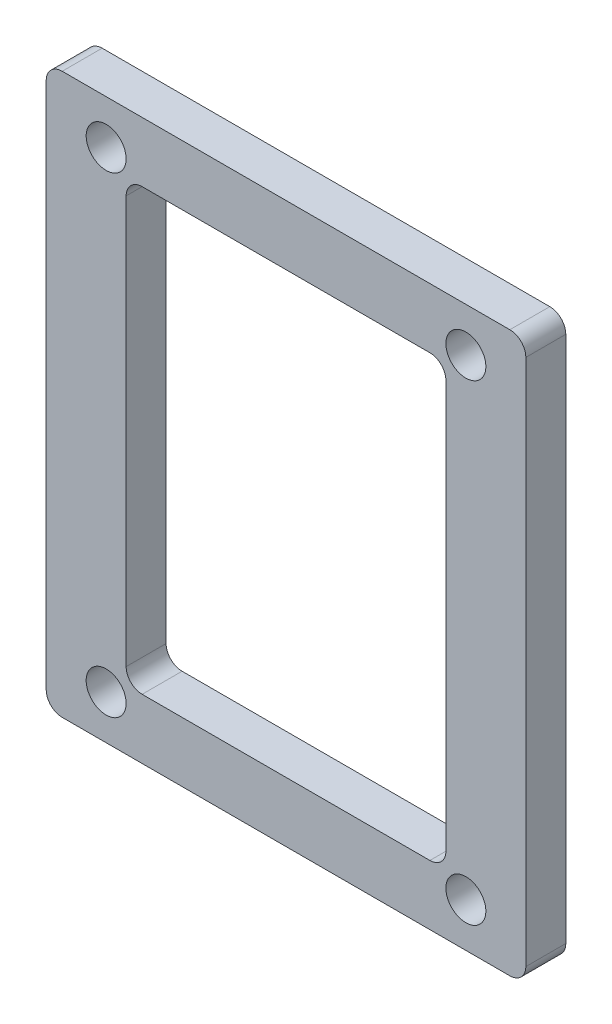
ISO-10303-21;
HEADER;
FILE_DESCRIPTION(('STEP AP214'),'2;1');
FILE_NAME('part.step','',(''),(''),'','','');
FILE_SCHEMA(('AUTOMOTIVE_DESIGN { 1 0 10303 214 1 1 1 1 }'));
ENDSEC;
DATA;
#1=APPLICATION_CONTEXT('core data for automotive mechanical design processes');
#2=APPLICATION_PROTOCOL_DEFINITION('international standard','automotive_design',2000,#1);
#3=PRODUCT_CONTEXT('',#1,'mechanical');
#4=PRODUCT('Part','Part','',(#3));
#5=PRODUCT_RELATED_PRODUCT_CATEGORY('part','',(#4));
#6=PRODUCT_DEFINITION_FORMATION('','',#4);
#7=PRODUCT_DEFINITION_CONTEXT('part definition',#1,'design');
#8=PRODUCT_DEFINITION('design','',#6,#7);
#9=PRODUCT_DEFINITION_SHAPE('','',#8);
#10=(LENGTH_UNIT() NAMED_UNIT(*) SI_UNIT(.MILLI.,.METRE.));
#11=(NAMED_UNIT(*) PLANE_ANGLE_UNIT() SI_UNIT($,.RADIAN.));
#12=(NAMED_UNIT(*) SI_UNIT($,.STERADIAN.) SOLID_ANGLE_UNIT());
#13=UNCERTAINTY_MEASURE_WITH_UNIT(LENGTH_MEASURE(1.E-05),#10,'distance_accuracy_value','');
#14=(GEOMETRIC_REPRESENTATION_CONTEXT(3) GLOBAL_UNCERTAINTY_ASSIGNED_CONTEXT((#13)) GLOBAL_UNIT_ASSIGNED_CONTEXT((#10,
#11,#12)) REPRESENTATION_CONTEXT('',''));
#15=CARTESIAN_POINT('',(0.,0.,0.));
#16=DIRECTION('',(0.,0.,1.));
#17=DIRECTION('',(1.,0.,0.));
#18=AXIS2_PLACEMENT_3D('',#15,#16,#17);
#19=CARTESIAN_POINT('',(-28.,-33.,5.));
#20=DIRECTION('',(0.,0.,-1.));
#21=DIRECTION('',(-1.,0.,0.));
#22=AXIS2_PLACEMENT_3D('',#19,#20,#21);
#23=CYLINDRICAL_SURFACE('',#22,2.);
#24=CARTESIAN_POINT('',(-28.,-33.,0.));
#25=DIRECTION('',(0.,0.,1.));
#26=DIRECTION('',(-1.,0.,0.));
#27=AXIS2_PLACEMENT_3D('',#24,#25,#26);
#28=CIRCLE('',#27,2.);
#29=CARTESIAN_POINT('',(-30.,-33.,0.));
#30=VERTEX_POINT('',#29);
#31=CARTESIAN_POINT('',(-28.,-35.,0.));
#32=VERTEX_POINT('',#31);
#33=EDGE_CURVE('E231',#30,#32,#28,.T.);
#34=ORIENTED_EDGE('',*,*,#33,.T.);
#35=DIRECTION('',(0.,0.,-1.));
#36=VECTOR('',#35,1.);
#37=CARTESIAN_POINT('',(-28.,-35.,5.));
#38=LINE('',#37,#36);
#39=CARTESIAN_POINT('',(-28.,-35.,5.));
#40=VERTEX_POINT('',#39);
#41=EDGE_CURVE('E11',#40,#32,#38,.T.);
#42=ORIENTED_EDGE('',*,*,#41,.F.);
#43=CARTESIAN_POINT('',(-28.,-33.,5.));
#44=DIRECTION('',(0.,0.,1.));
#45=DIRECTION('',(-1.,0.,0.));
#46=AXIS2_PLACEMENT_3D('',#43,#44,#45);
#47=CIRCLE('',#46,2.);
#48=CARTESIAN_POINT('',(-30.,-33.,5.));
#49=VERTEX_POINT('',#48);
#50=EDGE_CURVE('E249',#49,#40,#47,.T.);
#51=ORIENTED_EDGE('',*,*,#50,.F.);
#52=DIRECTION('',(0.,0.,-1.));
#53=VECTOR('',#52,1.);
#54=CARTESIAN_POINT('',(-30.,-33.,5.));
#55=LINE('',#54,#53);
#56=EDGE_CURVE('E275',#49,#30,#55,.T.);
#57=ORIENTED_EDGE('',*,*,#56,.T.);
#58=EDGE_LOOP('',(#34,#42,#51,#57));
#59=FACE_BOUND('',#58,.T.);
#60=ADVANCED_FACE('F39',(#59),#23,.T.);
#61=CARTESIAN_POINT('',(28.,-35.,5.));
#62=DIRECTION('',(0.,1.,0.));
#63=DIRECTION('',(-1.,0.,0.));
#64=AXIS2_PLACEMENT_3D('',#61,#62,#63);
#65=PLANE('',#64);
#66=DIRECTION('',(1.,0.,0.));
#67=VECTOR('',#66,1.);
#68=CARTESIAN_POINT('',(28.,-35.,0.));
#69=LINE('',#68,#67);
#70=CARTESIAN_POINT('',(28.,-35.,0.));
#71=VERTEX_POINT('',#70);
#72=EDGE_CURVE('E279',#32,#71,#69,.T.);
#73=ORIENTED_EDGE('',*,*,#72,.T.);
#74=DIRECTION('',(0.,0.,-1.));
#75=VECTOR('',#74,1.);
#76=CARTESIAN_POINT('',(28.,-35.,5.));
#77=LINE('',#76,#75);
#78=CARTESIAN_POINT('',(28.,-35.,5.));
#79=VERTEX_POINT('',#78);
#80=EDGE_CURVE('E47',#79,#71,#77,.T.);
#81=ORIENTED_EDGE('',*,*,#80,.F.);
#82=DIRECTION('',(1.,0.,0.));
#83=VECTOR('',#82,1.);
#84=CARTESIAN_POINT('',(28.,-35.,5.));
#85=LINE('',#84,#83);
#86=EDGE_CURVE('E253',#40,#79,#85,.T.);
#87=ORIENTED_EDGE('',*,*,#86,.F.);
#88=ORIENTED_EDGE('',*,*,#41,.T.);
#89=EDGE_LOOP('',(#73,#81,#87,#88));
#90=FACE_BOUND('',#89,.T.);
#91=ADVANCED_FACE('F348',(#90),#65,.F.);
#92=CARTESIAN_POINT('',(28.,-33.,5.));
#93=DIRECTION('',(0.,0.,-1.));
#94=DIRECTION('',(-1.,0.,0.));
#95=AXIS2_PLACEMENT_3D('',#92,#93,#94);
#96=CYLINDRICAL_SURFACE('',#95,2.);
#97=CARTESIAN_POINT('',(28.,-33.,0.));
#98=DIRECTION('',(0.,0.,1.));
#99=DIRECTION('',(1.,0.,0.));
#100=AXIS2_PLACEMENT_3D('',#97,#98,#99);
#101=CIRCLE('',#100,2.);
#102=CARTESIAN_POINT('',(30.,-33.,0.));
#103=VERTEX_POINT('',#102);
#104=EDGE_CURVE('E282',#71,#103,#101,.T.);
#105=ORIENTED_EDGE('',*,*,#104,.T.);
#106=DIRECTION('',(0.,0.,-1.));
#107=VECTOR('',#106,1.);
#108=CARTESIAN_POINT('',(30.,-33.,5.));
#109=LINE('',#108,#107);
#110=CARTESIAN_POINT('',(30.,-33.,5.));
#111=VERTEX_POINT('',#110);
#112=EDGE_CURVE('E318',#111,#103,#109,.T.);
#113=ORIENTED_EDGE('',*,*,#112,.F.);
#114=CARTESIAN_POINT('',(28.,-33.,5.));
#115=DIRECTION('',(0.,0.,1.));
#116=DIRECTION('',(1.,0.,0.));
#117=AXIS2_PLACEMENT_3D('',#114,#115,#116);
#118=CIRCLE('',#117,2.);
#119=EDGE_CURVE('E257',#79,#111,#118,.T.);
#120=ORIENTED_EDGE('',*,*,#119,.F.);
#121=ORIENTED_EDGE('',*,*,#80,.T.);
#122=EDGE_LOOP('',(#105,#113,#120,#121));
#123=FACE_BOUND('',#122,.T.);
#124=ADVANCED_FACE('F327',(#123),#96,.T.);
#125=CARTESIAN_POINT('',(30.,-33.,5.));
#126=DIRECTION('',(-1.,0.,0.));
#127=DIRECTION('',(0.,-1.,0.));
#128=AXIS2_PLACEMENT_3D('',#125,#126,#127);
#129=PLANE('',#128);
#130=DIRECTION('',(0.,1.,0.));
#131=VECTOR('',#130,1.);
#132=CARTESIAN_POINT('',(30.,-33.,0.));
#133=LINE('',#132,#131);
#134=CARTESIAN_POINT('',(30.,33.,0.));
#135=VERTEX_POINT('',#134);
#136=EDGE_CURVE('E285',#103,#135,#133,.T.);
#137=ORIENTED_EDGE('',*,*,#136,.T.);
#138=DIRECTION('',(0.,0.,-1.));
#139=VECTOR('',#138,1.);
#140=CARTESIAN_POINT('',(30.,33.,5.));
#141=LINE('',#140,#139);
#142=CARTESIAN_POINT('',(30.,33.,5.));
#143=VERTEX_POINT('',#142);
#144=EDGE_CURVE('E314',#143,#135,#141,.T.);
#145=ORIENTED_EDGE('',*,*,#144,.F.);
#146=DIRECTION('',(0.,1.,0.));
#147=VECTOR('',#146,1.);
#148=CARTESIAN_POINT('',(30.,-33.,5.));
#149=LINE('',#148,#147);
#150=EDGE_CURVE('E260',#111,#143,#149,.T.);
#151=ORIENTED_EDGE('',*,*,#150,.F.);
#152=ORIENTED_EDGE('',*,*,#112,.T.);
#153=EDGE_LOOP('',(#137,#145,#151,#152));
#154=FACE_BOUND('',#153,.T.);
#155=ADVANCED_FACE('F338',(#154),#129,.F.);
#156=CARTESIAN_POINT('',(28.,33.,5.));
#157=DIRECTION('',(0.,0.,-1.));
#158=DIRECTION('',(-1.,0.,0.));
#159=AXIS2_PLACEMENT_3D('',#156,#157,#158);
#160=CYLINDRICAL_SURFACE('',#159,2.);
#161=CARTESIAN_POINT('',(28.,33.,0.));
#162=DIRECTION('',(0.,0.,1.));
#163=DIRECTION('',(1.,0.,0.));
#164=AXIS2_PLACEMENT_3D('',#161,#162,#163);
#165=CIRCLE('',#164,2.);
#166=CARTESIAN_POINT('',(28.,35.,0.));
#167=VERTEX_POINT('',#166);
#168=EDGE_CURVE('E288',#135,#167,#165,.T.);
#169=ORIENTED_EDGE('',*,*,#168,.T.);
#170=DIRECTION('',(0.,0.,-1.));
#171=VECTOR('',#170,1.);
#172=CARTESIAN_POINT('',(28.,35.,5.));
#173=LINE('',#172,#171);
#174=CARTESIAN_POINT('',(28.,35.,5.));
#175=VERTEX_POINT('',#174);
#176=EDGE_CURVE('E310',#175,#167,#173,.T.);
#177=ORIENTED_EDGE('',*,*,#176,.F.);
#178=CARTESIAN_POINT('',(28.,33.,5.));
#179=DIRECTION('',(0.,0.,1.));
#180=DIRECTION('',(1.,0.,0.));
#181=AXIS2_PLACEMENT_3D('',#178,#179,#180);
#182=CIRCLE('',#181,2.);
#183=EDGE_CURVE('E263',#143,#175,#182,.T.);
#184=ORIENTED_EDGE('',*,*,#183,.F.);
#185=ORIENTED_EDGE('',*,*,#144,.T.);
#186=EDGE_LOOP('',(#169,#177,#184,#185));
#187=FACE_BOUND('',#186,.T.);
#188=ADVANCED_FACE('F342',(#187),#160,.T.);
#189=CARTESIAN_POINT('',(28.,35.,5.));
#190=DIRECTION('',(0.,-1.,0.));
#191=DIRECTION('',(0.,0.,-1.));
#192=AXIS2_PLACEMENT_3D('',#189,#190,#191);
#193=PLANE('',#192);
#194=DIRECTION('',(-1.,0.,0.));
#195=VECTOR('',#194,1.);
#196=CARTESIAN_POINT('',(28.,35.,0.));
#197=LINE('',#196,#195);
#198=CARTESIAN_POINT('',(-28.,35.,0.));
#199=VERTEX_POINT('',#198);
#200=EDGE_CURVE('E291',#167,#199,#197,.T.);
#201=ORIENTED_EDGE('',*,*,#200,.T.);
#202=DIRECTION('',(0.,0.,-1.));
#203=VECTOR('',#202,1.);
#204=CARTESIAN_POINT('',(-28.,35.,5.));
#205=LINE('',#204,#203);
#206=CARTESIAN_POINT('',(-28.,35.,5.));
#207=VERTEX_POINT('',#206);
#208=EDGE_CURVE('E306',#207,#199,#205,.T.);
#209=ORIENTED_EDGE('',*,*,#208,.F.);
#210=DIRECTION('',(-1.,0.,0.));
#211=VECTOR('',#210,1.);
#212=CARTESIAN_POINT('',(28.,35.,5.));
#213=LINE('',#212,#211);
#214=EDGE_CURVE('E266',#175,#207,#213,.T.);
#215=ORIENTED_EDGE('',*,*,#214,.F.);
#216=ORIENTED_EDGE('',*,*,#176,.T.);
#217=EDGE_LOOP('',(#201,#209,#215,#216));
#218=FACE_BOUND('',#217,.T.);
#219=ADVANCED_FACE('F361',(#218),#193,.F.);
#220=CARTESIAN_POINT('',(-28.,33.,5.));
#221=DIRECTION('',(0.,0.,-1.));
#222=DIRECTION('',(-1.,0.,0.));
#223=AXIS2_PLACEMENT_3D('',#220,#221,#222);
#224=CYLINDRICAL_SURFACE('',#223,2.00000000000001);
#225=CARTESIAN_POINT('',(-28.,33.,0.));
#226=DIRECTION('',(0.,0.,1.));
#227=DIRECTION('',(1.,0.,0.));
#228=AXIS2_PLACEMENT_3D('',#225,#226,#227);
#229=CIRCLE('',#228,2.00000000000001);
#230=CARTESIAN_POINT('',(-30.,33.,0.));
#231=VERTEX_POINT('',#230);
#232=EDGE_CURVE('E294',#199,#231,#229,.T.);
#233=ORIENTED_EDGE('',*,*,#232,.T.);
#234=DIRECTION('',(0.,0.,-1.));
#235=VECTOR('',#234,1.);
#236=CARTESIAN_POINT('',(-30.,33.,5.));
#237=LINE('',#236,#235);
#238=CARTESIAN_POINT('',(-30.,33.,5.));
#239=VERTEX_POINT('',#238);
#240=EDGE_CURVE('E302',#239,#231,#237,.T.);
#241=ORIENTED_EDGE('',*,*,#240,.F.);
#242=CARTESIAN_POINT('',(-28.,33.,5.));
#243=DIRECTION('',(0.,0.,1.));
#244=DIRECTION('',(1.,0.,0.));
#245=AXIS2_PLACEMENT_3D('',#242,#243,#244);
#246=CIRCLE('',#245,2.00000000000001);
#247=EDGE_CURVE('E269',#207,#239,#246,.T.);
#248=ORIENTED_EDGE('',*,*,#247,.F.);
#249=ORIENTED_EDGE('',*,*,#208,.T.);
#250=EDGE_LOOP('',(#233,#241,#248,#249));
#251=FACE_BOUND('',#250,.T.);
#252=ADVANCED_FACE('F359',(#251),#224,.T.);
#253=CARTESIAN_POINT('',(-30.,-33.,5.));
#254=DIRECTION('',(1.,0.,0.));
#255=DIRECTION('',(0.,1.,0.));
#256=AXIS2_PLACEMENT_3D('',#253,#254,#255);
#257=PLANE('',#256);
#258=DIRECTION('',(0.,-1.,0.));
#259=VECTOR('',#258,1.);
#260=CARTESIAN_POINT('',(-30.,-33.,0.));
#261=LINE('',#260,#259);
#262=EDGE_CURVE('E254',#231,#30,#261,.T.);
#263=ORIENTED_EDGE('',*,*,#262,.T.);
#264=ORIENTED_EDGE('',*,*,#56,.F.);
#265=DIRECTION('',(0.,-1.,0.));
#266=VECTOR('',#265,1.);
#267=CARTESIAN_POINT('',(-30.,-33.,5.));
#268=LINE('',#267,#266);
#269=EDGE_CURVE('E272',#239,#49,#268,.T.);
#270=ORIENTED_EDGE('',*,*,#269,.F.);
#271=ORIENTED_EDGE('',*,*,#240,.T.);
#272=EDGE_LOOP('',(#263,#264,#270,#271));
#273=FACE_BOUND('',#272,.T.);
#274=ADVANCED_FACE('F354',(#273),#257,.F.);
#275=CARTESIAN_POINT('',(-28.,-33.,5.));
#276=DIRECTION('',(0.,0.,-1.));
#277=DIRECTION('',(-1.,0.,0.));
#278=AXIS2_PLACEMENT_3D('',#275,#276,#277);
#279=PLANE('',#278);
#280=CARTESIAN_POINT('',(22.5,-29.5,5.));
#281=DIRECTION('',(0.,0.,1.));
#282=DIRECTION('',(1.,0.,0.));
#283=AXIS2_PLACEMENT_3D('',#280,#281,#282);
#284=CIRCLE('',#283,2.5);
#285=CARTESIAN_POINT('',(25.,-29.5,5.));
#286=VERTEX_POINT('',#285);
#287=EDGE_CURVE('E549',#286,#286,#284,.T.);
#288=ORIENTED_EDGE('',*,*,#287,.F.);
#289=EDGE_LOOP('',(#288));
#290=FACE_BOUND('',#289,.T.);
#291=CARTESIAN_POINT('',(-22.5,29.5000000000002,5.));
#292=DIRECTION('',(0.,0.,1.));
#293=DIRECTION('',(1.,0.,0.));
#294=AXIS2_PLACEMENT_3D('',#291,#292,#293);
#295=CIRCLE('',#294,2.5);
#296=CARTESIAN_POINT('',(-20.,29.5000000000002,5.));
#297=VERTEX_POINT('',#296);
#298=EDGE_CURVE('E557',#297,#297,#295,.T.);
#299=ORIENTED_EDGE('',*,*,#298,.F.);
#300=EDGE_LOOP('',(#299));
#301=FACE_BOUND('',#300,.T.);
#302=CARTESIAN_POINT('',(22.5,29.5000000000002,5.));
#303=DIRECTION('',(0.,0.,1.));
#304=DIRECTION('',(1.,0.,0.));
#305=AXIS2_PLACEMENT_3D('',#302,#303,#304);
#306=CIRCLE('',#305,2.5);
#307=CARTESIAN_POINT('',(25.,29.5000000000002,5.));
#308=VERTEX_POINT('',#307);
#309=EDGE_CURVE('E588',#308,#308,#306,.T.);
#310=ORIENTED_EDGE('',*,*,#309,.F.);
#311=EDGE_LOOP('',(#310));
#312=FACE_BOUND('',#311,.T.);
#313=CARTESIAN_POINT('',(-22.5,-29.5,5.));
#314=DIRECTION('',(0.,0.,1.));
#315=DIRECTION('',(1.,0.,0.));
#316=AXIS2_PLACEMENT_3D('',#313,#314,#315);
#317=CIRCLE('',#316,2.5);
#318=CARTESIAN_POINT('',(-20.,-29.5,5.));
#319=VERTEX_POINT('',#318);
#320=EDGE_CURVE('E181',#319,#319,#317,.T.);
#321=ORIENTED_EDGE('',*,*,#320,.F.);
#322=EDGE_LOOP('',(#321));
#323=FACE_BOUND('',#322,.T.);
#324=DIRECTION('',(0.,-1.,0.));
#325=VECTOR('',#324,1.);
#326=CARTESIAN_POINT('',(20.,-25.5,5.));
#327=LINE('',#326,#325);
#328=CARTESIAN_POINT('',(20.,25.5,5.));
#329=VERTEX_POINT('',#328);
#330=CARTESIAN_POINT('',(20.,-25.5,5.));
#331=VERTEX_POINT('',#330);
#332=EDGE_CURVE('E161',#329,#331,#327,.T.);
#333=ORIENTED_EDGE('',*,*,#332,.T.);
#334=CARTESIAN_POINT('',(18.,-25.5,5.));
#335=DIRECTION('',(0.,0.,-1.));
#336=DIRECTION('',(1.,0.,0.));
#337=AXIS2_PLACEMENT_3D('',#334,#335,#336);
#338=CIRCLE('',#337,2.);
#339=CARTESIAN_POINT('',(18.,-27.5,5.));
#340=VERTEX_POINT('',#339);
#341=EDGE_CURVE('E154',#331,#340,#338,.T.);
#342=ORIENTED_EDGE('',*,*,#341,.T.);
#343=DIRECTION('',(-1.,0.,0.));
#344=VECTOR('',#343,1.);
#345=CARTESIAN_POINT('',(-18.,-27.5,5.));
#346=LINE('',#345,#344);
#347=CARTESIAN_POINT('',(-18.,-27.5,5.));
#348=VERTEX_POINT('',#347);
#349=EDGE_CURVE('E164',#340,#348,#346,.T.);
#350=ORIENTED_EDGE('',*,*,#349,.T.);
#351=CARTESIAN_POINT('',(-18.,-25.5,5.));
#352=DIRECTION('',(0.,0.,-1.));
#353=DIRECTION('',(-1.,0.,0.));
#354=AXIS2_PLACEMENT_3D('',#351,#352,#353);
#355=CIRCLE('',#354,2.);
#356=CARTESIAN_POINT('',(-20.,-25.5,5.));
#357=VERTEX_POINT('',#356);
#358=EDGE_CURVE('E54',#348,#357,#355,.T.);
#359=ORIENTED_EDGE('',*,*,#358,.T.);
#360=DIRECTION('',(0.,1.,0.));
#361=VECTOR('',#360,1.);
#362=CARTESIAN_POINT('',(-20.,-25.5,5.));
#363=LINE('',#362,#361);
#364=CARTESIAN_POINT('',(-20.,25.5,5.));
#365=VERTEX_POINT('',#364);
#366=EDGE_CURVE('E186',#357,#365,#363,.T.);
#367=ORIENTED_EDGE('',*,*,#366,.T.);
#368=CARTESIAN_POINT('',(-18.,25.5,5.));
#369=DIRECTION('',(0.,0.,-1.));
#370=DIRECTION('',(-1.,0.,0.));
#371=AXIS2_PLACEMENT_3D('',#368,#369,#370);
#372=CIRCLE('',#371,2.);
#373=CARTESIAN_POINT('',(-18.,27.5,5.));
#374=VERTEX_POINT('',#373);
#375=EDGE_CURVE('E190',#365,#374,#372,.T.);
#376=ORIENTED_EDGE('',*,*,#375,.T.);
#377=DIRECTION('',(1.,0.,0.));
#378=VECTOR('',#377,1.);
#379=CARTESIAN_POINT('',(-18.,27.5,5.));
#380=LINE('',#379,#378);
#381=CARTESIAN_POINT('',(18.,27.5,5.));
#382=VERTEX_POINT('',#381);
#383=EDGE_CURVE('E194',#374,#382,#380,.T.);
#384=ORIENTED_EDGE('',*,*,#383,.T.);
#385=CARTESIAN_POINT('',(18.,25.5,5.));
#386=DIRECTION('',(0.,0.,-1.));
#387=DIRECTION('',(-1.,0.,0.));
#388=AXIS2_PLACEMENT_3D('',#385,#386,#387);
#389=CIRCLE('',#388,2.);
#390=EDGE_CURVE('E198',#382,#329,#389,.T.);
#391=ORIENTED_EDGE('',*,*,#390,.T.);
#392=EDGE_LOOP('',(#333,#342,#350,#359,#367,#376,#384,#391));
#393=FACE_BOUND('',#392,.T.);
#394=ORIENTED_EDGE('',*,*,#50,.T.);
#395=ORIENTED_EDGE('',*,*,#86,.T.);
#396=ORIENTED_EDGE('',*,*,#119,.T.);
#397=ORIENTED_EDGE('',*,*,#150,.T.);
#398=ORIENTED_EDGE('',*,*,#183,.T.);
#399=ORIENTED_EDGE('',*,*,#214,.T.);
#400=ORIENTED_EDGE('',*,*,#247,.T.);
#401=ORIENTED_EDGE('',*,*,#269,.T.);
#402=EDGE_LOOP('',(#394,#395,#396,#397,#398,#399,#400,#401));
#403=FACE_BOUND('',#402,.T.);
#404=ADVANCED_FACE('F169',(#290,#301,#312,#323,#393,#403),#279,.F.);
#405=CARTESIAN_POINT('',(-28.,-33.,0.));
#406=DIRECTION('',(0.,0.,-1.));
#407=DIRECTION('',(-1.,0.,0.));
#408=AXIS2_PLACEMENT_3D('',#405,#406,#407);
#409=PLANE('',#408);
#410=CARTESIAN_POINT('',(22.5,-29.5,0.));
#411=DIRECTION('',(0.,0.,1.));
#412=DIRECTION('',(1.,0.,0.));
#413=AXIS2_PLACEMENT_3D('',#410,#411,#412);
#414=CIRCLE('',#413,2.5);
#415=CARTESIAN_POINT('',(25.,-29.5,0.));
#416=VERTEX_POINT('',#415);
#417=EDGE_CURVE('E546',#416,#416,#414,.T.);
#418=ORIENTED_EDGE('',*,*,#417,.T.);
#419=EDGE_LOOP('',(#418));
#420=FACE_BOUND('',#419,.T.);
#421=CARTESIAN_POINT('',(-22.5,29.5000000000002,0.));
#422=DIRECTION('',(0.,0.,1.));
#423=DIRECTION('',(1.,0.,0.));
#424=AXIS2_PLACEMENT_3D('',#421,#422,#423);
#425=CIRCLE('',#424,2.5);
#426=CARTESIAN_POINT('',(-20.,29.5000000000002,0.));
#427=VERTEX_POINT('',#426);
#428=EDGE_CURVE('E551',#427,#427,#425,.T.);
#429=ORIENTED_EDGE('',*,*,#428,.T.);
#430=EDGE_LOOP('',(#429));
#431=FACE_BOUND('',#430,.T.);
#432=CARTESIAN_POINT('',(22.5,29.5000000000002,0.));
#433=DIRECTION('',(0.,0.,1.));
#434=DIRECTION('',(1.,0.,0.));
#435=AXIS2_PLACEMENT_3D('',#432,#433,#434);
#436=CIRCLE('',#435,2.5);
#437=CARTESIAN_POINT('',(25.,29.5000000000002,0.));
#438=VERTEX_POINT('',#437);
#439=EDGE_CURVE('E563',#438,#438,#436,.T.);
#440=ORIENTED_EDGE('',*,*,#439,.T.);
#441=EDGE_LOOP('',(#440));
#442=FACE_BOUND('',#441,.T.);
#443=CARTESIAN_POINT('',(-22.5,-29.5,0.));
#444=DIRECTION('',(0.,0.,1.));
#445=DIRECTION('',(1.,0.,0.));
#446=AXIS2_PLACEMENT_3D('',#443,#444,#445);
#447=CIRCLE('',#446,2.5);
#448=CARTESIAN_POINT('',(-20.,-29.5,0.));
#449=VERTEX_POINT('',#448);
#450=EDGE_CURVE('E206',#449,#449,#447,.T.);
#451=ORIENTED_EDGE('',*,*,#450,.T.);
#452=EDGE_LOOP('',(#451));
#453=FACE_BOUND('',#452,.T.);
#454=CARTESIAN_POINT('',(18.,-25.5,0.));
#455=DIRECTION('',(0.,0.,-1.));
#456=DIRECTION('',(1.,0.,0.));
#457=AXIS2_PLACEMENT_3D('',#454,#455,#456);
#458=CIRCLE('',#457,2.);
#459=CARTESIAN_POINT('',(20.,-25.5,0.));
#460=VERTEX_POINT('',#459);
#461=CARTESIAN_POINT('',(18.,-27.5,0.));
#462=VERTEX_POINT('',#461);
#463=EDGE_CURVE('E62',#460,#462,#458,.T.);
#464=ORIENTED_EDGE('',*,*,#463,.F.);
#465=DIRECTION('',(0.,-1.,0.));
#466=VECTOR('',#465,1.);
#467=CARTESIAN_POINT('',(20.,-25.5,0.));
#468=LINE('',#467,#466);
#469=CARTESIAN_POINT('',(20.,25.5,0.));
#470=VERTEX_POINT('',#469);
#471=EDGE_CURVE('E174',#470,#460,#468,.T.);
#472=ORIENTED_EDGE('',*,*,#471,.F.);
#473=CARTESIAN_POINT('',(18.,25.5,0.));
#474=DIRECTION('',(0.,0.,-1.));
#475=DIRECTION('',(-1.,0.,0.));
#476=AXIS2_PLACEMENT_3D('',#473,#474,#475);
#477=CIRCLE('',#476,2.);
#478=CARTESIAN_POINT('',(18.,27.5,0.));
#479=VERTEX_POINT('',#478);
#480=EDGE_CURVE('E178',#479,#470,#477,.T.);
#481=ORIENTED_EDGE('',*,*,#480,.F.);
#482=DIRECTION('',(1.,0.,0.));
#483=VECTOR('',#482,1.);
#484=CARTESIAN_POINT('',(-18.,27.5,0.));
#485=LINE('',#484,#483);
#486=CARTESIAN_POINT('',(-18.,27.5,0.));
#487=VERTEX_POINT('',#486);
#488=EDGE_CURVE('E221',#487,#479,#485,.T.);
#489=ORIENTED_EDGE('',*,*,#488,.F.);
#490=CARTESIAN_POINT('',(-18.,25.5,0.));
#491=DIRECTION('',(0.,0.,-1.));
#492=DIRECTION('',(-1.,0.,0.));
#493=AXIS2_PLACEMENT_3D('',#490,#491,#492);
#494=CIRCLE('',#493,2.);
#495=CARTESIAN_POINT('',(-20.,25.5,0.));
#496=VERTEX_POINT('',#495);
#497=EDGE_CURVE('E217',#496,#487,#494,.T.);
#498=ORIENTED_EDGE('',*,*,#497,.F.);
#499=DIRECTION('',(0.,1.,0.));
#500=VECTOR('',#499,1.);
#501=CARTESIAN_POINT('',(-20.,-25.5,0.));
#502=LINE('',#501,#500);
#503=CARTESIAN_POINT('',(-20.,-25.5,0.));
#504=VERTEX_POINT('',#503);
#505=EDGE_CURVE('E213',#504,#496,#502,.T.);
#506=ORIENTED_EDGE('',*,*,#505,.F.);
#507=CARTESIAN_POINT('',(-18.,-25.5,0.));
#508=DIRECTION('',(0.,0.,-1.));
#509=DIRECTION('',(-1.,0.,0.));
#510=AXIS2_PLACEMENT_3D('',#507,#508,#509);
#511=CIRCLE('',#510,2.);
#512=CARTESIAN_POINT('',(-18.,-27.5,0.));
#513=VERTEX_POINT('',#512);
#514=EDGE_CURVE('E209',#513,#504,#511,.T.);
#515=ORIENTED_EDGE('',*,*,#514,.F.);
#516=DIRECTION('',(-1.,0.,0.));
#517=VECTOR('',#516,1.);
#518=CARTESIAN_POINT('',(-18.,-27.5,0.));
#519=LINE('',#518,#517);
#520=EDGE_CURVE('E205',#462,#513,#519,.T.);
#521=ORIENTED_EDGE('',*,*,#520,.F.);
#522=EDGE_LOOP('',(#464,#472,#481,#489,#498,#506,#515,#521));
#523=FACE_BOUND('',#522,.T.);
#524=ORIENTED_EDGE('',*,*,#33,.F.);
#525=ORIENTED_EDGE('',*,*,#262,.F.);
#526=ORIENTED_EDGE('',*,*,#232,.F.);
#527=ORIENTED_EDGE('',*,*,#200,.F.);
#528=ORIENTED_EDGE('',*,*,#168,.F.);
#529=ORIENTED_EDGE('',*,*,#136,.F.);
#530=ORIENTED_EDGE('',*,*,#104,.F.);
#531=ORIENTED_EDGE('',*,*,#72,.F.);
#532=EDGE_LOOP('',(#524,#525,#526,#527,#528,#529,#530,#531));
#533=FACE_BOUND('',#532,.T.);
#534=ADVANCED_FACE('F333',(#420,#431,#442,#453,#523,#533),#409,.T.);
#535=CARTESIAN_POINT('',(18.,-25.5,5.));
#536=DIRECTION('',(0.,0.,-1.));
#537=DIRECTION('',(-1.,0.,0.));
#538=AXIS2_PLACEMENT_3D('',#535,#536,#537);
#539=CYLINDRICAL_SURFACE('',#538,2.);
#540=ORIENTED_EDGE('',*,*,#463,.T.);
#541=DIRECTION('',(0.,0.,-1.));
#542=VECTOR('',#541,1.);
#543=CARTESIAN_POINT('',(18.,-27.5,5.));
#544=LINE('',#543,#542);
#545=EDGE_CURVE('E150',#340,#462,#544,.T.);
#546=ORIENTED_EDGE('',*,*,#545,.F.);
#547=ORIENTED_EDGE('',*,*,#341,.F.);
#548=DIRECTION('',(0.,0.,-1.));
#549=VECTOR('',#548,1.);
#550=CARTESIAN_POINT('',(20.,-25.5,5.));
#551=LINE('',#550,#549);
#552=EDGE_CURVE('E228',#331,#460,#551,.T.);
#553=ORIENTED_EDGE('',*,*,#552,.T.);
#554=EDGE_LOOP('',(#540,#546,#547,#553));
#555=FACE_BOUND('',#554,.T.);
#556=ADVANCED_FACE('F152',(#555),#539,.F.);
#557=CARTESIAN_POINT('',(20.,-25.5,5.));
#558=DIRECTION('',(1.,0.,0.));
#559=DIRECTION('',(0.,0.,-1.));
#560=AXIS2_PLACEMENT_3D('',#557,#558,#559);
#561=PLANE('',#560);
#562=ORIENTED_EDGE('',*,*,#471,.T.);
#563=ORIENTED_EDGE('',*,*,#552,.F.);
#564=ORIENTED_EDGE('',*,*,#332,.F.);
#565=DIRECTION('',(0.,0.,-1.));
#566=VECTOR('',#565,1.);
#567=CARTESIAN_POINT('',(20.,25.5,5.));
#568=LINE('',#567,#566);
#569=EDGE_CURVE('E232',#329,#470,#568,.T.);
#570=ORIENTED_EDGE('',*,*,#569,.T.);
#571=EDGE_LOOP('',(#562,#563,#564,#570));
#572=FACE_BOUND('',#571,.T.);
#573=ADVANCED_FACE('F417',(#572),#561,.F.);
#574=CARTESIAN_POINT('',(18.,25.5,5.));
#575=DIRECTION('',(0.,0.,-1.));
#576=DIRECTION('',(-1.,0.,0.));
#577=AXIS2_PLACEMENT_3D('',#574,#575,#576);
#578=CYLINDRICAL_SURFACE('',#577,2.);
#579=ORIENTED_EDGE('',*,*,#480,.T.);
#580=ORIENTED_EDGE('',*,*,#569,.F.);
#581=ORIENTED_EDGE('',*,*,#390,.F.);
#582=DIRECTION('',(0.,0.,-1.));
#583=VECTOR('',#582,1.);
#584=CARTESIAN_POINT('',(18.,27.5,5.));
#585=LINE('',#584,#583);
#586=EDGE_CURVE('E235',#382,#479,#585,.T.);
#587=ORIENTED_EDGE('',*,*,#586,.T.);
#588=EDGE_LOOP('',(#579,#580,#581,#587));
#589=FACE_BOUND('',#588,.T.);
#590=ADVANCED_FACE('F428',(#589),#578,.F.);
#591=CARTESIAN_POINT('',(-18.,27.5,5.));
#592=DIRECTION('',(0.,1.,0.));
#593=DIRECTION('',(-1.,0.,0.));
#594=AXIS2_PLACEMENT_3D('',#591,#592,#593);
#595=PLANE('',#594);
#596=ORIENTED_EDGE('',*,*,#488,.T.);
#597=ORIENTED_EDGE('',*,*,#586,.F.);
#598=ORIENTED_EDGE('',*,*,#383,.F.);
#599=DIRECTION('',(0.,0.,-1.));
#600=VECTOR('',#599,1.);
#601=CARTESIAN_POINT('',(-18.,27.5,5.));
#602=LINE('',#601,#600);
#603=EDGE_CURVE('E238',#374,#487,#602,.T.);
#604=ORIENTED_EDGE('',*,*,#603,.T.);
#605=EDGE_LOOP('',(#596,#597,#598,#604));
#606=FACE_BOUND('',#605,.T.);
#607=ADVANCED_FACE('F438',(#606),#595,.F.);
#608=CARTESIAN_POINT('',(-18.,25.5,5.));
#609=DIRECTION('',(0.,0.,-1.));
#610=DIRECTION('',(-1.,0.,0.));
#611=AXIS2_PLACEMENT_3D('',#608,#609,#610);
#612=CYLINDRICAL_SURFACE('',#611,2.);
#613=ORIENTED_EDGE('',*,*,#497,.T.);
#614=ORIENTED_EDGE('',*,*,#603,.F.);
#615=ORIENTED_EDGE('',*,*,#375,.F.);
#616=DIRECTION('',(0.,0.,-1.));
#617=VECTOR('',#616,1.);
#618=CARTESIAN_POINT('',(-20.,25.5,5.));
#619=LINE('',#618,#617);
#620=EDGE_CURVE('E241',#365,#496,#619,.T.);
#621=ORIENTED_EDGE('',*,*,#620,.T.);
#622=EDGE_LOOP('',(#613,#614,#615,#621));
#623=FACE_BOUND('',#622,.T.);
#624=ADVANCED_FACE('F448',(#623),#612,.F.);
#625=CARTESIAN_POINT('',(-20.,-25.5,5.));
#626=DIRECTION('',(-1.,0.,0.));
#627=DIRECTION('',(0.,-1.,0.));
#628=AXIS2_PLACEMENT_3D('',#625,#626,#627);
#629=PLANE('',#628);
#630=ORIENTED_EDGE('',*,*,#505,.T.);
#631=ORIENTED_EDGE('',*,*,#620,.F.);
#632=ORIENTED_EDGE('',*,*,#366,.F.);
#633=DIRECTION('',(0.,0.,-1.));
#634=VECTOR('',#633,1.);
#635=CARTESIAN_POINT('',(-20.,-25.5,5.));
#636=LINE('',#635,#634);
#637=EDGE_CURVE('E244',#357,#504,#636,.T.);
#638=ORIENTED_EDGE('',*,*,#637,.T.);
#639=EDGE_LOOP('',(#630,#631,#632,#638));
#640=FACE_BOUND('',#639,.T.);
#641=ADVANCED_FACE('F458',(#640),#629,.F.);
#642=CARTESIAN_POINT('',(-18.,-25.5,5.));
#643=DIRECTION('',(0.,0.,-1.));
#644=DIRECTION('',(-1.,0.,0.));
#645=AXIS2_PLACEMENT_3D('',#642,#643,#644);
#646=CYLINDRICAL_SURFACE('',#645,2.);
#647=ORIENTED_EDGE('',*,*,#514,.T.);
#648=ORIENTED_EDGE('',*,*,#637,.F.);
#649=ORIENTED_EDGE('',*,*,#358,.F.);
#650=DIRECTION('',(0.,0.,-1.));
#651=VECTOR('',#650,1.);
#652=CARTESIAN_POINT('',(-18.,-27.5,5.));
#653=LINE('',#652,#651);
#654=EDGE_CURVE('E160',#348,#513,#653,.T.);
#655=ORIENTED_EDGE('',*,*,#654,.T.);
#656=EDGE_LOOP('',(#647,#648,#649,#655));
#657=FACE_BOUND('',#656,.T.);
#658=ADVANCED_FACE('F468',(#657),#646,.F.);
#659=CARTESIAN_POINT('',(-18.,-27.5,5.));
#660=DIRECTION('',(0.,-1.,0.));
#661=DIRECTION('',(1.,0.,0.));
#662=AXIS2_PLACEMENT_3D('',#659,#660,#661);
#663=PLANE('',#662);
#664=ORIENTED_EDGE('',*,*,#520,.T.);
#665=ORIENTED_EDGE('',*,*,#654,.F.);
#666=ORIENTED_EDGE('',*,*,#349,.F.);
#667=ORIENTED_EDGE('',*,*,#545,.T.);
#668=EDGE_LOOP('',(#664,#665,#666,#667));
#669=FACE_BOUND('',#668,.T.);
#670=ADVANCED_FACE('F165',(#669),#663,.F.);
#671=CARTESIAN_POINT('',(-22.5,-29.5,0.));
#672=DIRECTION('',(0.,0.,1.));
#673=DIRECTION('',(1.,0.,0.));
#674=AXIS2_PLACEMENT_3D('',#671,#672,#673);
#675=CYLINDRICAL_SURFACE('',#674,2.5);
#676=ORIENTED_EDGE('',*,*,#450,.F.);
#677=EDGE_LOOP('',(#676));
#678=FACE_BOUND('',#677,.T.);
#679=ORIENTED_EDGE('',*,*,#320,.T.);
#680=EDGE_LOOP('',(#679));
#681=FACE_BOUND('',#680,.T.);
#682=ADVANCED_FACE('F486',(#678,#681),#675,.F.);
#683=CARTESIAN_POINT('',(22.5,29.5000000000002,0.));
#684=DIRECTION('',(0.,0.,1.));
#685=DIRECTION('',(1.,0.,0.));
#686=AXIS2_PLACEMENT_3D('',#683,#684,#685);
#687=CYLINDRICAL_SURFACE('',#686,2.5);
#688=ORIENTED_EDGE('',*,*,#439,.F.);
#689=EDGE_LOOP('',(#688));
#690=FACE_BOUND('',#689,.T.);
#691=ORIENTED_EDGE('',*,*,#309,.T.);
#692=EDGE_LOOP('',(#691));
#693=FACE_BOUND('',#692,.T.);
#694=ADVANCED_FACE('F509',(#690,#693),#687,.F.);
#695=CARTESIAN_POINT('',(-22.5,29.5000000000002,0.));
#696=DIRECTION('',(0.,0.,1.));
#697=DIRECTION('',(1.,0.,0.));
#698=AXIS2_PLACEMENT_3D('',#695,#696,#697);
#699=CYLINDRICAL_SURFACE('',#698,2.5);
#700=ORIENTED_EDGE('',*,*,#428,.F.);
#701=EDGE_LOOP('',(#700));
#702=FACE_BOUND('',#701,.T.);
#703=ORIENTED_EDGE('',*,*,#298,.T.);
#704=EDGE_LOOP('',(#703));
#705=FACE_BOUND('',#704,.T.);
#706=ADVANCED_FACE('F519',(#702,#705),#699,.F.);
#707=CARTESIAN_POINT('',(22.5,-29.5,0.));
#708=DIRECTION('',(0.,0.,1.));
#709=DIRECTION('',(1.,0.,0.));
#710=AXIS2_PLACEMENT_3D('',#707,#708,#709);
#711=CYLINDRICAL_SURFACE('',#710,2.5);
#712=ORIENTED_EDGE('',*,*,#417,.F.);
#713=EDGE_LOOP('',(#712));
#714=FACE_BOUND('',#713,.T.);
#715=ORIENTED_EDGE('',*,*,#287,.T.);
#716=EDGE_LOOP('',(#715));
#717=FACE_BOUND('',#716,.T.);
#718=ADVANCED_FACE('F529',(#714,#717),#711,.F.);
#719=CLOSED_SHELL('',(#60,#91,#124,#155,#188,#219,#252,#274,#404,#534,#556,#573,#590,#607,#624,
#641,#658,#670,#682,#694,#706,#718));
#720=MANIFOLD_SOLID_BREP('B2',#719);
#721=ADVANCED_BREP_SHAPE_REPRESENTATION('',(#18,#720),#14);
#722=SHAPE_DEFINITION_REPRESENTATION(#9,#721);
ENDSEC;
END-ISO-10303-21;
